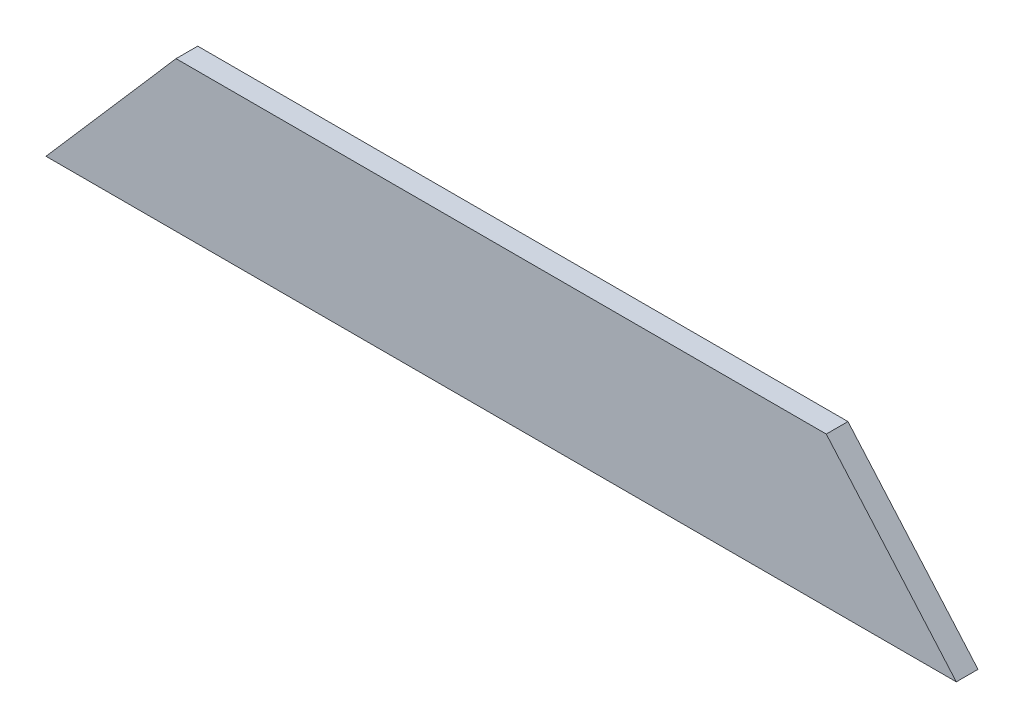
ISO-10303-21;
HEADER;
FILE_DESCRIPTION(('STEP AP214'),'2;1');
FILE_NAME('part.step','',(''),(''),'','','');
FILE_SCHEMA(('AUTOMOTIVE_DESIGN { 1 0 10303 214 1 1 1 1 }'));
ENDSEC;
DATA;
#1=APPLICATION_CONTEXT('core data for automotive mechanical design processes');
#2=APPLICATION_PROTOCOL_DEFINITION('international standard','automotive_design',2000,#1);
#3=PRODUCT_CONTEXT('',#1,'mechanical');
#4=PRODUCT('Part','Part','',(#3));
#5=PRODUCT_RELATED_PRODUCT_CATEGORY('part','',(#4));
#6=PRODUCT_DEFINITION_FORMATION('','',#4);
#7=PRODUCT_DEFINITION_CONTEXT('part definition',#1,'design');
#8=PRODUCT_DEFINITION('design','',#6,#7);
#9=PRODUCT_DEFINITION_SHAPE('','',#8);
#10=(LENGTH_UNIT() NAMED_UNIT(*) SI_UNIT(.MILLI.,.METRE.));
#11=(NAMED_UNIT(*) PLANE_ANGLE_UNIT() SI_UNIT($,.RADIAN.));
#12=(NAMED_UNIT(*) SI_UNIT($,.STERADIAN.) SOLID_ANGLE_UNIT());
#13=UNCERTAINTY_MEASURE_WITH_UNIT(LENGTH_MEASURE(1.E-05),#10,'distance_accuracy_value','');
#14=(GEOMETRIC_REPRESENTATION_CONTEXT(3) GLOBAL_UNCERTAINTY_ASSIGNED_CONTEXT((#13)) GLOBAL_UNIT_ASSIGNED_CONTEXT((#10,
#11,#12)) REPRESENTATION_CONTEXT('',''));
#15=CARTESIAN_POINT('',(0.,0.,0.));
#16=DIRECTION('',(0.,0.,1.));
#17=DIRECTION('',(1.,0.,0.));
#18=AXIS2_PLACEMENT_3D('',#15,#16,#17);
#19=CARTESIAN_POINT('',(12.,13.804420886652,2.));
#20=DIRECTION('',(0.754709580222769,-0.656059028990511,0.));
#21=DIRECTION('',(0.656059028990511,0.754709580222769,0.));
#22=AXIS2_PLACEMENT_3D('',#19,#20,#21);
#23=PLANE('',#22);
#24=DIRECTION('',(-0.656059028990511,-0.754709580222769,0.));
#25=VECTOR('',#24,1.);
#26=CARTESIAN_POINT('',(12.,13.804420886652,0.));
#27=LINE('',#26,#25);
#28=CARTESIAN_POINT('',(12.,13.804420886652,0.));
#29=VERTEX_POINT('',#28);
#30=CARTESIAN_POINT('',(0.,0.,0.));
#31=VERTEX_POINT('',#30);
#32=EDGE_CURVE('E100',#29,#31,#27,.T.);
#33=ORIENTED_EDGE('',*,*,#32,.T.);
#34=DIRECTION('',(0.,0.,-1.));
#35=VECTOR('',#34,1.);
#36=CARTESIAN_POINT('',(0.,0.,2.));
#37=LINE('',#36,#35);
#38=CARTESIAN_POINT('',(0.,0.,2.));
#39=VERTEX_POINT('',#38);
#40=EDGE_CURVE('E11',#39,#31,#37,.T.);
#41=ORIENTED_EDGE('',*,*,#40,.F.);
#42=DIRECTION('',(-0.656059028990511,-0.754709580222769,0.));
#43=VECTOR('',#42,1.);
#44=CARTESIAN_POINT('',(12.,13.804420886652,2.));
#45=LINE('',#44,#43);
#46=CARTESIAN_POINT('',(12.,13.804420886652,2.));
#47=VERTEX_POINT('',#46);
#48=EDGE_CURVE('E88',#47,#39,#45,.T.);
#49=ORIENTED_EDGE('',*,*,#48,.F.);
#50=DIRECTION('',(0.,0.,-1.));
#51=VECTOR('',#50,1.);
#52=CARTESIAN_POINT('',(12.,13.804420886652,2.));
#53=LINE('',#52,#51);
#54=EDGE_CURVE('E96',#47,#29,#53,.T.);
#55=ORIENTED_EDGE('',*,*,#54,.T.);
#56=EDGE_LOOP('',(#33,#41,#49,#55));
#57=FACE_BOUND('',#56,.T.);
#58=ADVANCED_FACE('F37',(#57),#23,.F.);
#59=CARTESIAN_POINT('',(0.,0.,2.));
#60=DIRECTION('',(0.,1.,0.));
#61=DIRECTION('',(0.,0.,1.));
#62=AXIS2_PLACEMENT_3D('',#59,#60,#61);
#63=PLANE('',#62);
#64=DIRECTION('',(1.,0.,0.));
#65=VECTOR('',#64,1.);
#66=CARTESIAN_POINT('',(0.,0.,0.));
#67=LINE('',#66,#65);
#68=CARTESIAN_POINT('',(84.,0.,0.));
#69=VERTEX_POINT('',#68);
#70=EDGE_CURVE('E92',#31,#69,#67,.T.);
#71=ORIENTED_EDGE('',*,*,#70,.T.);
#72=DIRECTION('',(0.,0.,-1.));
#73=VECTOR('',#72,1.);
#74=CARTESIAN_POINT('',(84.,0.,2.));
#75=LINE('',#74,#73);
#76=CARTESIAN_POINT('',(84.,0.,2.));
#77=VERTEX_POINT('',#76);
#78=EDGE_CURVE('E45',#77,#69,#75,.T.);
#79=ORIENTED_EDGE('',*,*,#78,.F.);
#80=DIRECTION('',(1.,0.,0.));
#81=VECTOR('',#80,1.);
#82=CARTESIAN_POINT('',(0.,0.,2.));
#83=LINE('',#82,#81);
#84=EDGE_CURVE('E83',#39,#77,#83,.T.);
#85=ORIENTED_EDGE('',*,*,#84,.F.);
#86=ORIENTED_EDGE('',*,*,#40,.T.);
#87=EDGE_LOOP('',(#71,#79,#85,#86));
#88=FACE_BOUND('',#87,.T.);
#89=ADVANCED_FACE('F91',(#88),#63,.F.);
#90=CARTESIAN_POINT('',(84.,0.,2.));
#91=DIRECTION('',(-0.754709580222769,-0.656059028990511,0.));
#92=DIRECTION('',(0.656059028990511,-0.754709580222769,0.));
#93=AXIS2_PLACEMENT_3D('',#90,#91,#92);
#94=PLANE('',#93);
#95=DIRECTION('',(-0.656059028990511,0.754709580222769,0.));
#96=VECTOR('',#95,1.);
#97=CARTESIAN_POINT('',(84.,0.,0.));
#98=LINE('',#97,#96);
#99=CARTESIAN_POINT('',(72.,13.804420886652,0.));
#100=VERTEX_POINT('',#99);
#101=EDGE_CURVE('E70',#69,#100,#98,.T.);
#102=ORIENTED_EDGE('',*,*,#101,.T.);
#103=DIRECTION('',(0.,0.,-1.));
#104=VECTOR('',#103,1.);
#105=CARTESIAN_POINT('',(72.,13.804420886652,2.));
#106=LINE('',#105,#104);
#107=CARTESIAN_POINT('',(72.,13.804420886652,2.));
#108=VERTEX_POINT('',#107);
#109=EDGE_CURVE('E93',#108,#100,#106,.T.);
#110=ORIENTED_EDGE('',*,*,#109,.F.);
#111=DIRECTION('',(-0.656059028990511,0.754709580222769,0.));
#112=VECTOR('',#111,1.);
#113=CARTESIAN_POINT('',(84.,0.,2.));
#114=LINE('',#113,#112);
#115=EDGE_CURVE('E86',#77,#108,#114,.T.);
#116=ORIENTED_EDGE('',*,*,#115,.F.);
#117=ORIENTED_EDGE('',*,*,#78,.T.);
#118=EDGE_LOOP('',(#102,#110,#116,#117));
#119=FACE_BOUND('',#118,.T.);
#120=ADVANCED_FACE('F94',(#119),#94,.F.);
#121=CARTESIAN_POINT('',(72.,13.804420886652,2.));
#122=DIRECTION('',(0.,-1.,0.));
#123=DIRECTION('',(1.,0.,0.));
#124=AXIS2_PLACEMENT_3D('',#121,#122,#123);
#125=PLANE('',#124);
#126=DIRECTION('',(-1.,0.,0.));
#127=VECTOR('',#126,1.);
#128=CARTESIAN_POINT('',(72.,13.804420886652,0.));
#129=LINE('',#128,#127);
#130=EDGE_CURVE('E76',#100,#29,#129,.T.);
#131=ORIENTED_EDGE('',*,*,#130,.T.);
#132=ORIENTED_EDGE('',*,*,#54,.F.);
#133=DIRECTION('',(-1.,0.,0.));
#134=VECTOR('',#133,1.);
#135=CARTESIAN_POINT('',(72.,13.804420886652,2.));
#136=LINE('',#135,#134);
#137=EDGE_CURVE('E53',#108,#47,#136,.T.);
#138=ORIENTED_EDGE('',*,*,#137,.F.);
#139=ORIENTED_EDGE('',*,*,#109,.T.);
#140=EDGE_LOOP('',(#131,#132,#138,#139));
#141=FACE_BOUND('',#140,.T.);
#142=ADVANCED_FACE('F107',(#141),#125,.F.);
#143=CARTESIAN_POINT('',(0.,0.,2.));
#144=DIRECTION('',(0.,0.,-1.));
#145=DIRECTION('',(-1.,0.,0.));
#146=AXIS2_PLACEMENT_3D('',#143,#144,#145);
#147=PLANE('',#146);
#148=ORIENTED_EDGE('',*,*,#48,.T.);
#149=ORIENTED_EDGE('',*,*,#84,.T.);
#150=ORIENTED_EDGE('',*,*,#115,.T.);
#151=ORIENTED_EDGE('',*,*,#137,.T.);
#152=EDGE_LOOP('',(#148,#149,#150,#151));
#153=FACE_BOUND('',#152,.T.);
#154=ADVANCED_FACE('F84',(#153),#147,.F.);
#155=CARTESIAN_POINT('',(0.,0.,0.));
#156=DIRECTION('',(0.,0.,-1.));
#157=DIRECTION('',(-1.,0.,0.));
#158=AXIS2_PLACEMENT_3D('',#155,#156,#157);
#159=PLANE('',#158);
#160=ORIENTED_EDGE('',*,*,#32,.F.);
#161=ORIENTED_EDGE('',*,*,#130,.F.);
#162=ORIENTED_EDGE('',*,*,#101,.F.);
#163=ORIENTED_EDGE('',*,*,#70,.F.);
#164=EDGE_LOOP('',(#160,#161,#162,#163));
#165=FACE_BOUND('',#164,.T.);
#166=ADVANCED_FACE('F110',(#165),#159,.T.);
#167=CLOSED_SHELL('',(#58,#89,#120,#142,#154,#166));
#168=MANIFOLD_SOLID_BREP('B2',#167);
#169=ADVANCED_BREP_SHAPE_REPRESENTATION('',(#18,#168),#14);
#170=SHAPE_DEFINITION_REPRESENTATION(#9,#169);
ENDSEC;
END-ISO-10303-21;
